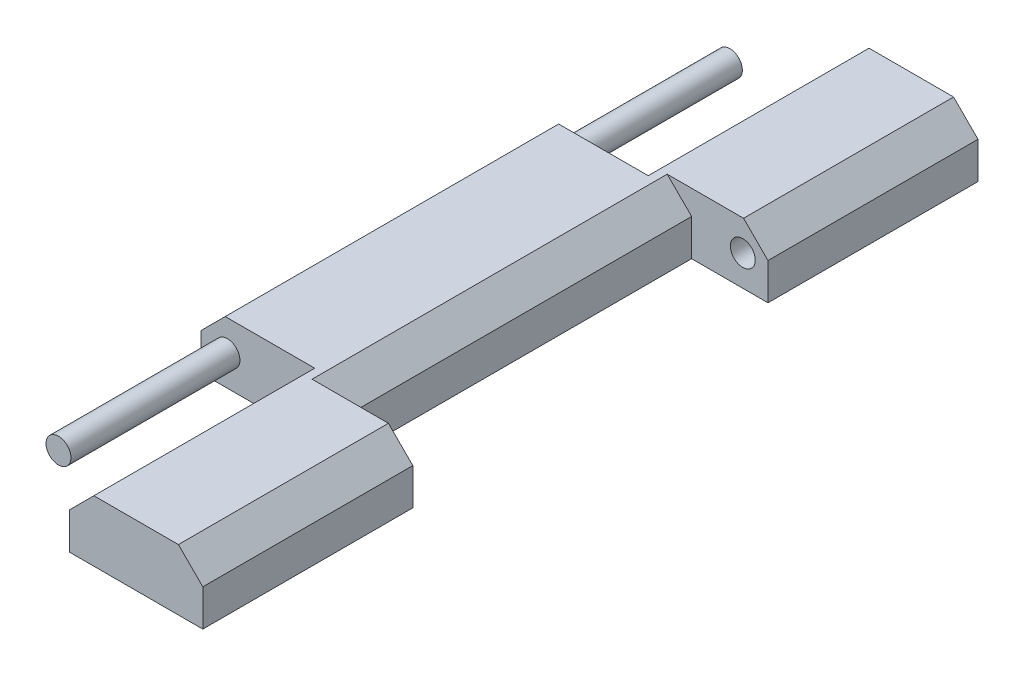
ISO-10303-21;
HEADER;
FILE_DESCRIPTION(('STEP AP214'),'2;1');
FILE_NAME('part.step','',(''),(''),'','','');
FILE_SCHEMA(('AUTOMOTIVE_DESIGN { 1 0 10303 214 1 1 1 1 }'));
ENDSEC;
DATA;
#1=APPLICATION_CONTEXT('core data for automotive mechanical design processes');
#2=APPLICATION_PROTOCOL_DEFINITION('international standard','automotive_design',2000,#1);
#3=PRODUCT_CONTEXT('',#1,'mechanical');
#4=PRODUCT('Part','Part','',(#3));
#5=PRODUCT_RELATED_PRODUCT_CATEGORY('part','',(#4));
#6=PRODUCT_DEFINITION_FORMATION('','',#4);
#7=PRODUCT_DEFINITION_CONTEXT('part definition',#1,'design');
#8=PRODUCT_DEFINITION('design','',#6,#7);
#9=PRODUCT_DEFINITION_SHAPE('','',#8);
#10=(LENGTH_UNIT() NAMED_UNIT(*) SI_UNIT(.MILLI.,.METRE.));
#11=(NAMED_UNIT(*) PLANE_ANGLE_UNIT() SI_UNIT($,.RADIAN.));
#12=(NAMED_UNIT(*) SI_UNIT($,.STERADIAN.) SOLID_ANGLE_UNIT());
#13=UNCERTAINTY_MEASURE_WITH_UNIT(LENGTH_MEASURE(1.E-05),#10,'distance_accuracy_value','');
#14=(GEOMETRIC_REPRESENTATION_CONTEXT(3) GLOBAL_UNCERTAINTY_ASSIGNED_CONTEXT((#13)) GLOBAL_UNIT_ASSIGNED_CONTEXT((#10,
#11,#12)) REPRESENTATION_CONTEXT('',''));
#15=CARTESIAN_POINT('',(0.,0.,0.));
#16=DIRECTION('',(0.,0.,1.));
#17=DIRECTION('',(1.,0.,0.));
#18=AXIS2_PLACEMENT_3D('',#15,#16,#17);
#19=CARTESIAN_POINT('',(-6.13161438081057,5.92420723275193,-42.8625));
#20=DIRECTION('',(0.,0.,1.));
#21=DIRECTION('',(-1.,0.,0.));
#22=AXIS2_PLACEMENT_3D('',#19,#20,#21);
#23=PLANE('',#22);
#24=DIRECTION('',(0.,-1.,0.));
#25=VECTOR('',#24,1.);
#26=CARTESIAN_POINT('',(8.61607262485704,5.92420723275193,-42.8625));
#27=LINE('',#26,#25);
#28=CARTESIAN_POINT('',(8.61607262485704,3.22420723275193,-42.8625));
#29=VERTEX_POINT('',#28);
#30=CARTESIAN_POINT('',(8.61607262485704,-0.825792767248064,-42.8625));
#31=VERTEX_POINT('',#30);
#32=EDGE_CURVE('E169',#29,#31,#27,.T.);
#33=ORIENTED_EDGE('',*,*,#32,.T.);
#34=DIRECTION('',(1.,0.,0.));
#35=VECTOR('',#34,1.);
#36=CARTESIAN_POINT('',(-6.13161438081057,-0.825792767248064,-42.8625));
#37=LINE('',#36,#35);
#38=CARTESIAN_POINT('',(-6.13161438081057,-0.825792767248064,-42.8625));
#39=VERTEX_POINT('',#38);
#40=EDGE_CURVE('E175',#39,#31,#37,.T.);
#41=ORIENTED_EDGE('',*,*,#40,.F.);
#42=DIRECTION('',(0.,-1.,0.));
#43=VECTOR('',#42,1.);
#44=CARTESIAN_POINT('',(-6.13161438081057,5.92420723275193,-42.8625));
#45=LINE('',#44,#43);
#46=CARTESIAN_POINT('',(-6.13161438081057,3.22420723275193,-42.8625));
#47=VERTEX_POINT('',#46);
#48=EDGE_CURVE('E274',#47,#39,#45,.T.);
#49=ORIENTED_EDGE('',*,*,#48,.F.);
#50=DIRECTION('',(0.707106781186548,0.707106781186548,0.));
#51=VECTOR('',#50,1.);
#52=CARTESIAN_POINT('',(-3.43161438081056,5.92420723275195,-42.8625));
#53=LINE('',#52,#51);
#54=CARTESIAN_POINT('',(-3.43161438081057,5.92420723275193,-42.8625));
#55=VERTEX_POINT('',#54);
#56=EDGE_CURVE('E225',#55,#47,#53,.F.);
#57=ORIENTED_EDGE('',*,*,#56,.F.);
#58=DIRECTION('',(1.,0.,0.));
#59=VECTOR('',#58,1.);
#60=CARTESIAN_POINT('',(-6.13161438081057,5.92420723275193,-42.8625));
#61=LINE('',#60,#59);
#62=CARTESIAN_POINT('',(5.91607262485704,5.92420723275193,-42.8625));
#63=VERTEX_POINT('',#62);
#64=EDGE_CURVE('E258',#55,#63,#61,.T.);
#65=ORIENTED_EDGE('',*,*,#64,.T.);
#66=DIRECTION('',(0.707106781186548,-0.707106781186548,0.));
#67=VECTOR('',#66,1.);
#68=CARTESIAN_POINT('',(5.91607262485758,5.92420723275139,-42.8625));
#69=LINE('',#68,#67);
#70=EDGE_CURVE('E189',#29,#63,#69,.F.);
#71=ORIENTED_EDGE('',*,*,#70,.F.);
#72=EDGE_LOOP('',(#33,#41,#49,#57,#65,#71));
#73=FACE_BOUND('',#72,.T.);
#74=ADVANCED_FACE('F37',(#73),#23,.F.);
#75=CARTESIAN_POINT('',(8.61607262485762,5.92420723275193,-19.6362347014294));
#76=DIRECTION('',(-1.,0.,0.));
#77=DIRECTION('',(0.,0.,-1.));
#78=AXIS2_PLACEMENT_3D('',#75,#76,#77);
#79=PLANE('',#78);
#80=DIRECTION('',(0.,-1.,0.));
#81=VECTOR('',#80,1.);
#82=CARTESIAN_POINT('',(8.61607262485762,5.92420723275193,-19.6362347014294));
#83=LINE('',#82,#81);
#84=CARTESIAN_POINT('',(8.61607262485762,3.22420723275193,-19.6362347014294));
#85=VERTEX_POINT('',#84);
#86=CARTESIAN_POINT('',(8.61607262485762,-0.825792767248064,-19.6362347014294));
#87=VERTEX_POINT('',#86);
#88=EDGE_CURVE('E171',#85,#87,#83,.T.);
#89=ORIENTED_EDGE('',*,*,#88,.T.);
#90=DIRECTION('',(0.,0.,1.));
#91=VECTOR('',#90,1.);
#92=CARTESIAN_POINT('',(8.61607262485762,-0.825792767248064,-19.6362347014294));
#93=LINE('',#92,#91);
#94=EDGE_CURVE('E164',#31,#87,#93,.T.);
#95=ORIENTED_EDGE('',*,*,#94,.F.);
#96=ORIENTED_EDGE('',*,*,#32,.F.);
#97=DIRECTION('',(0.,0.,-1.));
#98=VECTOR('',#97,1.);
#99=CARTESIAN_POINT('',(8.61607262485762,3.22420723275193,-19.6362347014294));
#100=LINE('',#99,#98);
#101=EDGE_CURVE('E223',#85,#29,#100,.T.);
#102=ORIENTED_EDGE('',*,*,#101,.F.);
#103=EDGE_LOOP('',(#89,#95,#96,#102));
#104=FACE_BOUND('',#103,.T.);
#105=ADVANCED_FACE('F166',(#104),#79,.F.);
#106=CARTESIAN_POINT('',(8.61607262485762,5.92420723275193,-19.6362347014294));
#107=DIRECTION('',(0.,0.,-1.));
#108=DIRECTION('',(1.,0.,0.));
#109=AXIS2_PLACEMENT_3D('',#106,#107,#108);
#110=PLANE('',#109);
#111=CARTESIAN_POINT('',(5.8326217708247,2.54920723275193,-19.6362347014294));
#112=DIRECTION('',(0.,0.,1.));
#113=DIRECTION('',(1.,0.,0.));
#114=AXIS2_PLACEMENT_3D('',#111,#112,#113);
#115=CIRCLE('',#114,1.37928339962338);
#116=CARTESIAN_POINT('',(7.21190517044808,2.54920723275193,-19.6362347014294));
#117=VERTEX_POINT('',#116);
#118=EDGE_CURVE('E253',#117,#117,#115,.F.);
#119=ORIENTED_EDGE('',*,*,#118,.T.);
#120=EDGE_LOOP('',(#119));
#121=FACE_BOUND('',#120,.T.);
#122=DIRECTION('',(-1.,0.,0.));
#123=VECTOR('',#122,1.);
#124=CARTESIAN_POINT('',(8.61607262485762,5.92420723275193,-19.6362347014294));
#125=LINE('',#124,#123);
#126=CARTESIAN_POINT('',(5.91607262485761,5.92420723275193,-19.6362347014294));
#127=VERTEX_POINT('',#126);
#128=CARTESIAN_POINT('',(-2.52710417271163,5.92420723275193,-19.6362347014294));
#129=VERTEX_POINT('',#128);
#130=EDGE_CURVE('E260',#127,#129,#125,.T.);
#131=ORIENTED_EDGE('',*,*,#130,.T.);
#132=DIRECTION('',(0.707106781186546,-0.707106781186549,0.));
#133=VECTOR('',#132,1.);
#134=CARTESIAN_POINT('',(3.04448422607298,0.352618833967311,-19.6362347014294));
#135=LINE('',#134,#133);
#136=CARTESIAN_POINT('',(0.172895827288381,3.22420723275191,-19.6362347014294));
#137=VERTEX_POINT('',#136);
#138=EDGE_CURVE('E46',#137,#129,#135,.F.);
#139=ORIENTED_EDGE('',*,*,#138,.F.);
#140=DIRECTION('',(0.,-1.,0.));
#141=VECTOR('',#140,1.);
#142=CARTESIAN_POINT('',(0.172895827288381,5.92420723275193,-19.6362347014294));
#143=LINE('',#142,#141);
#144=CARTESIAN_POINT('',(0.172895827288381,-0.825792767248064,-19.6362347014294));
#145=VERTEX_POINT('',#144);
#146=EDGE_CURVE('E194',#137,#145,#143,.T.);
#147=ORIENTED_EDGE('',*,*,#146,.T.);
#148=DIRECTION('',(-1.,0.,0.));
#149=VECTOR('',#148,1.);
#150=CARTESIAN_POINT('',(8.61607262485762,-0.825792767248064,-19.6362347014294));
#151=LINE('',#150,#149);
#152=EDGE_CURVE('E174',#87,#145,#151,.T.);
#153=ORIENTED_EDGE('',*,*,#152,.F.);
#154=ORIENTED_EDGE('',*,*,#88,.F.);
#155=DIRECTION('',(-0.707106781186548,0.707106781186548,0.));
#156=VECTOR('',#155,1.);
#157=CARTESIAN_POINT('',(5.91607262485786,5.92420723275169,-19.6362347014294));
#158=LINE('',#157,#156);
#159=EDGE_CURVE('E221',#127,#85,#158,.F.);
#160=ORIENTED_EDGE('',*,*,#159,.F.);
#161=EDGE_LOOP('',(#131,#139,#147,#153,#154,#160));
#162=FACE_BOUND('',#161,.T.);
#163=ADVANCED_FACE('F329',(#121,#162),#110,.F.);
#164=CARTESIAN_POINT('',(0.172895827288381,5.92420723275193,-19.6362347014294));
#165=DIRECTION('',(-1.,0.,0.));
#166=DIRECTION('',(0.,0.,-1.));
#167=AXIS2_PLACEMENT_3D('',#164,#165,#166);
#168=PLANE('',#167);
#169=DIRECTION('',(0.,-1.,0.));
#170=VECTOR('',#169,1.);
#171=CARTESIAN_POINT('',(0.172895827288381,5.92420723275193,19.6362347014294));
#172=LINE('',#171,#170);
#173=CARTESIAN_POINT('',(0.172895827288381,3.22420723275191,19.6362347014294));
#174=VERTEX_POINT('',#173);
#175=CARTESIAN_POINT('',(0.172895827288381,-0.825792767248064,19.6362347014294));
#176=VERTEX_POINT('',#175);
#177=EDGE_CURVE('E323',#174,#176,#172,.T.);
#178=ORIENTED_EDGE('',*,*,#177,.T.);
#179=DIRECTION('',(0.,0.,1.));
#180=VECTOR('',#179,1.);
#181=CARTESIAN_POINT('',(0.172895827288381,-0.825792767248064,-19.6362347014294));
#182=LINE('',#181,#180);
#183=EDGE_CURVE('E277',#145,#176,#182,.T.);
#184=ORIENTED_EDGE('',*,*,#183,.F.);
#185=ORIENTED_EDGE('',*,*,#146,.F.);
#186=DIRECTION('',(0.,0.,-1.));
#187=VECTOR('',#186,1.);
#188=CARTESIAN_POINT('',(0.172895827288381,3.22420723275191,-19.6362347014294));
#189=LINE('',#188,#187);
#190=EDGE_CURVE('E219',#174,#137,#189,.T.);
#191=ORIENTED_EDGE('',*,*,#190,.F.);
#192=EDGE_LOOP('',(#178,#184,#185,#191));
#193=FACE_BOUND('',#192,.T.);
#194=ADVANCED_FACE('F332',(#193),#168,.F.);
#195=CARTESIAN_POINT('',(8.61607262485761,5.92420723275193,19.6362347014294));
#196=DIRECTION('',(0.,0.,1.));
#197=DIRECTION('',(-1.,0.,0.));
#198=AXIS2_PLACEMENT_3D('',#195,#196,#197);
#199=PLANE('',#198);
#200=CARTESIAN_POINT('',(5.8326217708247,2.54920723275193,19.6362347014294));
#201=DIRECTION('',(0.,0.,-1.));
#202=DIRECTION('',(-1.,0.,0.));
#203=AXIS2_PLACEMENT_3D('',#200,#201,#202);
#204=CIRCLE('',#203,1.37928339962338);
#205=CARTESIAN_POINT('',(4.45333837120131,2.54920723275193,19.6362347014294));
#206=VERTEX_POINT('',#205);
#207=EDGE_CURVE('E41',#206,#206,#204,.F.);
#208=ORIENTED_EDGE('',*,*,#207,.T.);
#209=EDGE_LOOP('',(#208));
#210=FACE_BOUND('',#209,.T.);
#211=DIRECTION('',(0.,-1.,0.));
#212=VECTOR('',#211,1.);
#213=CARTESIAN_POINT('',(8.61607262485761,5.92420723275193,19.6362347014294));
#214=LINE('',#213,#212);
#215=CARTESIAN_POINT('',(8.61607262485761,3.22420723275191,19.6362347014294));
#216=VERTEX_POINT('',#215);
#217=CARTESIAN_POINT('',(8.61607262485761,-0.825792767248064,19.6362347014294));
#218=VERTEX_POINT('',#217);
#219=EDGE_CURVE('E320',#216,#218,#214,.T.);
#220=ORIENTED_EDGE('',*,*,#219,.T.);
#221=DIRECTION('',(1.,0.,0.));
#222=VECTOR('',#221,1.);
#223=CARTESIAN_POINT('',(8.61607262485761,-0.825792767248064,19.6362347014294));
#224=LINE('',#223,#222);
#225=EDGE_CURVE('E280',#176,#218,#224,.T.);
#226=ORIENTED_EDGE('',*,*,#225,.F.);
#227=ORIENTED_EDGE('',*,*,#177,.F.);
#228=DIRECTION('',(-0.707106781186546,0.707106781186549,0.));
#229=VECTOR('',#228,1.);
#230=CARTESIAN_POINT('',(3.04448422607297,0.352618833967311,19.6362347014294));
#231=LINE('',#230,#229);
#232=CARTESIAN_POINT('',(-2.52710417271163,5.92420723275193,19.6362347014294));
#233=VERTEX_POINT('',#232);
#234=EDGE_CURVE('E237',#233,#174,#231,.F.);
#235=ORIENTED_EDGE('',*,*,#234,.F.);
#236=DIRECTION('',(1.,0.,0.));
#237=VECTOR('',#236,1.);
#238=CARTESIAN_POINT('',(8.61607262485761,5.92420723275193,19.6362347014294));
#239=LINE('',#238,#237);
#240=CARTESIAN_POINT('',(5.9160726248576,5.92420723275193,19.6362347014294));
#241=VERTEX_POINT('',#240);
#242=EDGE_CURVE('E263',#233,#241,#239,.T.);
#243=ORIENTED_EDGE('',*,*,#242,.T.);
#244=DIRECTION('',(0.707106781186546,-0.707106781186549,0.));
#245=VECTOR('',#244,1.);
#246=CARTESIAN_POINT('',(5.91607262485785,5.92420723275168,19.6362347014294));
#247=LINE('',#246,#245);
#248=EDGE_CURVE('E214',#216,#241,#247,.F.);
#249=ORIENTED_EDGE('',*,*,#248,.F.);
#250=EDGE_LOOP('',(#220,#226,#227,#235,#243,#249));
#251=FACE_BOUND('',#250,.T.);
#252=ADVANCED_FACE('F337',(#210,#251),#199,.F.);
#253=CARTESIAN_POINT('',(8.61607262485703,5.92420723275193,42.8625));
#254=DIRECTION('',(-1.,0.,0.));
#255=DIRECTION('',(0.,0.,-1.));
#256=AXIS2_PLACEMENT_3D('',#253,#254,#255);
#257=PLANE('',#256);
#258=DIRECTION('',(0.,-1.,0.));
#259=VECTOR('',#258,1.);
#260=CARTESIAN_POINT('',(8.61607262485703,5.92420723275193,42.8625));
#261=LINE('',#260,#259);
#262=CARTESIAN_POINT('',(8.61607262485703,3.22420723275191,42.8625));
#263=VERTEX_POINT('',#262);
#264=CARTESIAN_POINT('',(8.61607262485703,-0.825792767248064,42.8625));
#265=VERTEX_POINT('',#264);
#266=EDGE_CURVE('E317',#263,#265,#261,.T.);
#267=ORIENTED_EDGE('',*,*,#266,.T.);
#268=DIRECTION('',(0.,0.,1.));
#269=VECTOR('',#268,1.);
#270=CARTESIAN_POINT('',(8.61607262485703,-0.825792767248064,42.8625));
#271=LINE('',#270,#269);
#272=EDGE_CURVE('E283',#218,#265,#271,.T.);
#273=ORIENTED_EDGE('',*,*,#272,.F.);
#274=ORIENTED_EDGE('',*,*,#219,.F.);
#275=DIRECTION('',(0.,0.,-1.));
#276=VECTOR('',#275,1.);
#277=CARTESIAN_POINT('',(8.61607262485703,3.22420723275191,42.8625));
#278=LINE('',#277,#276);
#279=EDGE_CURVE('E212',#263,#216,#278,.T.);
#280=ORIENTED_EDGE('',*,*,#279,.F.);
#281=EDGE_LOOP('',(#267,#273,#274,#280));
#282=FACE_BOUND('',#281,.T.);
#283=ADVANCED_FACE('F340',(#282),#257,.F.);
#284=CARTESIAN_POINT('',(-6.13161438081057,5.92420723275193,42.8625));
#285=DIRECTION('',(0.,0.,-1.));
#286=DIRECTION('',(1.,0.,0.));
#287=AXIS2_PLACEMENT_3D('',#284,#285,#286);
#288=PLANE('',#287);
#289=DIRECTION('',(-1.,0.,0.));
#290=VECTOR('',#289,1.);
#291=CARTESIAN_POINT('',(-6.13161438081057,5.92420723275193,42.8625));
#292=LINE('',#291,#290);
#293=CARTESIAN_POINT('',(5.91607262485702,5.92420723275193,42.8625));
#294=VERTEX_POINT('',#293);
#295=CARTESIAN_POINT('',(-3.43161438081056,5.92420723275193,42.8625));
#296=VERTEX_POINT('',#295);
#297=EDGE_CURVE('E266',#294,#296,#292,.T.);
#298=ORIENTED_EDGE('',*,*,#297,.T.);
#299=DIRECTION('',(-0.707106781186546,-0.707106781186549,0.));
#300=VECTOR('',#299,1.);
#301=CARTESIAN_POINT('',(-3.43161438081058,5.92420723275191,42.8625));
#302=LINE('',#301,#300);
#303=CARTESIAN_POINT('',(-6.13161438081057,3.22420723275191,42.8625));
#304=VERTEX_POINT('',#303);
#305=EDGE_CURVE('E207',#304,#296,#302,.F.);
#306=ORIENTED_EDGE('',*,*,#305,.F.);
#307=DIRECTION('',(0.,-1.,0.));
#308=VECTOR('',#307,1.);
#309=CARTESIAN_POINT('',(-6.13161438081057,5.92420723275193,42.8625));
#310=LINE('',#309,#308);
#311=CARTESIAN_POINT('',(-6.13161438081057,-0.825792767248064,42.8625));
#312=VERTEX_POINT('',#311);
#313=EDGE_CURVE('E314',#304,#312,#310,.T.);
#314=ORIENTED_EDGE('',*,*,#313,.T.);
#315=DIRECTION('',(-1.,0.,0.));
#316=VECTOR('',#315,1.);
#317=CARTESIAN_POINT('',(-6.13161438081057,-0.825792767248064,42.8625));
#318=LINE('',#317,#316);
#319=EDGE_CURVE('E286',#265,#312,#318,.T.);
#320=ORIENTED_EDGE('',*,*,#319,.F.);
#321=ORIENTED_EDGE('',*,*,#266,.F.);
#322=DIRECTION('',(-0.707106781186546,0.707106781186549,0.));
#323=VECTOR('',#322,1.);
#324=CARTESIAN_POINT('',(5.91607262485754,5.92420723275141,42.8625));
#325=LINE('',#324,#323);
#326=EDGE_CURVE('E210',#294,#263,#325,.F.);
#327=ORIENTED_EDGE('',*,*,#326,.F.);
#328=EDGE_LOOP('',(#298,#306,#314,#320,#321,#327));
#329=FACE_BOUND('',#328,.T.);
#330=ADVANCED_FACE('F344',(#329),#288,.F.);
#331=CARTESIAN_POINT('',(-6.13161438081057,5.92420723275193,42.8625));
#332=DIRECTION('',(1.,0.,0.));
#333=DIRECTION('',(0.,0.,1.));
#334=AXIS2_PLACEMENT_3D('',#331,#332,#333);
#335=PLANE('',#334);
#336=DIRECTION('',(0.,-1.,0.));
#337=VECTOR('',#336,1.);
#338=CARTESIAN_POINT('',(-6.13161438081058,5.92420723275193,18.4379950481214));
#339=LINE('',#338,#337);
#340=CARTESIAN_POINT('',(-6.13161438081058,3.22420723275191,18.4379950481214));
#341=VERTEX_POINT('',#340);
#342=CARTESIAN_POINT('',(-6.13161438081058,-0.825792767248064,18.4379950481214));
#343=VERTEX_POINT('',#342);
#344=EDGE_CURVE('E311',#341,#343,#339,.T.);
#345=ORIENTED_EDGE('',*,*,#344,.T.);
#346=DIRECTION('',(0.,0.,-1.));
#347=VECTOR('',#346,1.);
#348=CARTESIAN_POINT('',(-6.13161438081057,-0.825792767248064,42.8625));
#349=LINE('',#348,#347);
#350=EDGE_CURVE('E289',#312,#343,#349,.T.);
#351=ORIENTED_EDGE('',*,*,#350,.F.);
#352=ORIENTED_EDGE('',*,*,#313,.F.);
#353=DIRECTION('',(0.,0.,1.));
#354=VECTOR('',#353,1.);
#355=CARTESIAN_POINT('',(-6.13161438081057,3.22420723275191,42.8625));
#356=LINE('',#355,#354);
#357=EDGE_CURVE('E217',#341,#304,#356,.T.);
#358=ORIENTED_EDGE('',*,*,#357,.F.);
#359=EDGE_LOOP('',(#345,#351,#352,#358));
#360=FACE_BOUND('',#359,.T.);
#361=ADVANCED_FACE('F351',(#360),#335,.F.);
#362=CARTESIAN_POINT('',(-16.0321087449545,5.92420723275193,18.4379950481215));
#363=DIRECTION('',(0.,0.,-1.));
#364=DIRECTION('',(1.,0.,0.));
#365=AXIS2_PLACEMENT_3D('',#362,#363,#364);
#366=PLANE('',#365);
#367=CARTESIAN_POINT('',(-13.0836136147864,2.54920723275193,18.4379950481215));
#368=DIRECTION('',(0.,0.,1.));
#369=DIRECTION('',(1.,0.,0.));
#370=AXIS2_PLACEMENT_3D('',#367,#368,#369);
#371=CIRCLE('',#370,1.37928339962338);
#372=CARTESIAN_POINT('',(-11.7043302151631,2.54920723275193,18.4379950481215));
#373=VERTEX_POINT('',#372);
#374=EDGE_CURVE('E184',#373,#373,#371,.T.);
#375=ORIENTED_EDGE('',*,*,#374,.F.);
#376=EDGE_LOOP('',(#375));
#377=FACE_BOUND('',#376,.T.);
#378=DIRECTION('',(0.,-1.,0.));
#379=VECTOR('',#378,1.);
#380=CARTESIAN_POINT('',(-16.0321087449545,5.92420723275193,18.4379950481215));
#381=LINE('',#380,#379);
#382=CARTESIAN_POINT('',(-16.0321087449545,3.22420723275191,18.4379950481215));
#383=VERTEX_POINT('',#382);
#384=CARTESIAN_POINT('',(-16.0321087449545,-0.825792767248064,18.4379950481215));
#385=VERTEX_POINT('',#384);
#386=EDGE_CURVE('E308',#383,#385,#381,.T.);
#387=ORIENTED_EDGE('',*,*,#386,.T.);
#388=DIRECTION('',(-1.,0.,0.));
#389=VECTOR('',#388,1.);
#390=CARTESIAN_POINT('',(-16.0321087449545,-0.825792767248064,18.4379950481215));
#391=LINE('',#390,#389);
#392=EDGE_CURVE('E292',#343,#385,#391,.T.);
#393=ORIENTED_EDGE('',*,*,#392,.F.);
#394=ORIENTED_EDGE('',*,*,#344,.F.);
#395=DIRECTION('',(0.707106781186546,0.707106781186549,0.));
#396=VECTOR('',#395,1.);
#397=CARTESIAN_POINT('',(-9.73186156288253,-0.376039949320052,18.4379950481215));
#398=LINE('',#397,#396);
#399=CARTESIAN_POINT('',(-3.43161438081058,5.92420723275193,18.4379950481214));
#400=VERTEX_POINT('',#399);
#401=EDGE_CURVE('E235',#400,#341,#398,.F.);
#402=ORIENTED_EDGE('',*,*,#401,.F.);
#403=DIRECTION('',(-1.,0.,0.));
#404=VECTOR('',#403,1.);
#405=CARTESIAN_POINT('',(-16.0321087449545,5.92420723275193,18.4379950481215));
#406=LINE('',#405,#404);
#407=CARTESIAN_POINT('',(-13.3321087449545,5.92420723275193,18.4379950481215));
#408=VERTEX_POINT('',#407);
#409=EDGE_CURVE('E269',#400,#408,#406,.T.);
#410=ORIENTED_EDGE('',*,*,#409,.T.);
#411=DIRECTION('',(-0.707106781186546,-0.707106781186549,0.));
#412=VECTOR('',#411,1.);
#413=CARTESIAN_POINT('',(-13.3321087449546,5.9242072327519,18.4379950481215));
#414=LINE('',#413,#412);
#415=EDGE_CURVE('E233',#383,#408,#414,.F.);
#416=ORIENTED_EDGE('',*,*,#415,.F.);
#417=EDGE_LOOP('',(#387,#393,#394,#402,#410,#416));
#418=FACE_BOUND('',#417,.T.);
#419=ADVANCED_FACE('F354',(#377,#418),#366,.F.);
#420=CARTESIAN_POINT('',(-16.0321087449545,5.92420723275193,18.4379950481215));
#421=DIRECTION('',(1.,0.,0.));
#422=DIRECTION('',(0.,0.,1.));
#423=AXIS2_PLACEMENT_3D('',#420,#421,#422);
#424=PLANE('',#423);
#425=DIRECTION('',(0.,-1.,0.));
#426=VECTOR('',#425,1.);
#427=CARTESIAN_POINT('',(-16.0321087449549,5.92420723275193,-18.4379950481214));
#428=LINE('',#427,#426);
#429=CARTESIAN_POINT('',(-16.0321087449549,3.22420723275191,-18.4379950481214));
#430=VERTEX_POINT('',#429);
#431=CARTESIAN_POINT('',(-16.0321087449549,-0.825792767248064,-18.4379950481214));
#432=VERTEX_POINT('',#431);
#433=EDGE_CURVE('E305',#430,#432,#428,.T.);
#434=ORIENTED_EDGE('',*,*,#433,.T.);
#435=DIRECTION('',(0.,0.,-1.));
#436=VECTOR('',#435,1.);
#437=CARTESIAN_POINT('',(-16.0321087449545,-0.825792767248064,18.4379950481215));
#438=LINE('',#437,#436);
#439=EDGE_CURVE('E295',#385,#432,#438,.T.);
#440=ORIENTED_EDGE('',*,*,#439,.F.);
#441=ORIENTED_EDGE('',*,*,#386,.F.);
#442=DIRECTION('',(0.,0.,1.));
#443=VECTOR('',#442,1.);
#444=CARTESIAN_POINT('',(-16.0321087449545,3.22420723275191,18.4379950481215));
#445=LINE('',#444,#443);
#446=EDGE_CURVE('E54',#430,#383,#445,.T.);
#447=ORIENTED_EDGE('',*,*,#446,.F.);
#448=EDGE_LOOP('',(#434,#440,#441,#447));
#449=FACE_BOUND('',#448,.T.);
#450=ADVANCED_FACE('F357',(#449),#424,.F.);
#451=CARTESIAN_POINT('',(-16.0321087449549,5.92420723275193,-18.4379950481214));
#452=DIRECTION('',(0.,0.,1.));
#453=DIRECTION('',(-1.,0.,0.));
#454=AXIS2_PLACEMENT_3D('',#451,#452,#453);
#455=PLANE('',#454);
#456=CARTESIAN_POINT('',(-13.0836136147864,2.54920723275193,-18.4379950481214));
#457=DIRECTION('',(0.,0.,-1.));
#458=DIRECTION('',(-1.,0.,0.));
#459=AXIS2_PLACEMENT_3D('',#456,#457,#458);
#460=CIRCLE('',#459,1.37928339962338);
#461=CARTESIAN_POINT('',(-14.4628970144098,2.54920723275193,-18.4379950481214));
#462=VERTEX_POINT('',#461);
#463=EDGE_CURVE('E240',#462,#462,#460,.T.);
#464=ORIENTED_EDGE('',*,*,#463,.F.);
#465=EDGE_LOOP('',(#464));
#466=FACE_BOUND('',#465,.T.);
#467=DIRECTION('',(1.,0.,0.));
#468=VECTOR('',#467,1.);
#469=CARTESIAN_POINT('',(-16.0321087449549,5.92420723275193,-18.4379950481214));
#470=LINE('',#469,#468);
#471=CARTESIAN_POINT('',(-13.3321087449549,5.92420723275193,-18.4379950481214));
#472=VERTEX_POINT('',#471);
#473=CARTESIAN_POINT('',(-3.43161438081057,5.92420723275193,-18.4379950481214));
#474=VERTEX_POINT('',#473);
#475=EDGE_CURVE('E272',#472,#474,#470,.T.);
#476=ORIENTED_EDGE('',*,*,#475,.T.);
#477=DIRECTION('',(-0.707106781186548,-0.707106781186548,0.));
#478=VECTOR('',#477,1.);
#479=CARTESIAN_POINT('',(-9.73186156288273,-0.376039949320231,-18.4379950481214));
#480=LINE('',#479,#478);
#481=CARTESIAN_POINT('',(-6.13161438081057,3.22420723275193,-18.4379950481214));
#482=VERTEX_POINT('',#481);
#483=EDGE_CURVE('E11',#482,#474,#480,.F.);
#484=ORIENTED_EDGE('',*,*,#483,.F.);
#485=DIRECTION('',(0.,-1.,0.));
#486=VECTOR('',#485,1.);
#487=CARTESIAN_POINT('',(-6.13161438081057,5.92420723275193,-18.4379950481214));
#488=LINE('',#487,#486);
#489=CARTESIAN_POINT('',(-6.13161438081057,-0.825792767248064,-18.4379950481214));
#490=VERTEX_POINT('',#489);
#491=EDGE_CURVE('E302',#482,#490,#488,.T.);
#492=ORIENTED_EDGE('',*,*,#491,.T.);
#493=DIRECTION('',(1.,0.,0.));
#494=VECTOR('',#493,1.);
#495=CARTESIAN_POINT('',(-16.0321087449549,-0.825792767248064,-18.4379950481214));
#496=LINE('',#495,#494);
#497=EDGE_CURVE('E298',#432,#490,#496,.T.);
#498=ORIENTED_EDGE('',*,*,#497,.F.);
#499=ORIENTED_EDGE('',*,*,#433,.F.);
#500=DIRECTION('',(0.707106781186546,0.707106781186549,0.));
#501=VECTOR('',#500,1.);
#502=CARTESIAN_POINT('',(-13.3321087449548,5.92420723275199,-18.4379950481214));
#503=LINE('',#502,#501);
#504=EDGE_CURVE('E59',#472,#430,#503,.F.);
#505=ORIENTED_EDGE('',*,*,#504,.F.);
#506=EDGE_LOOP('',(#476,#484,#492,#498,#499,#505));
#507=FACE_BOUND('',#506,.T.);
#508=ADVANCED_FACE('F362',(#466,#507),#455,.F.);
#509=CARTESIAN_POINT('',(-6.13161438081057,5.92420723275193,-18.4379950481214));
#510=DIRECTION('',(1.,0.,0.));
#511=DIRECTION('',(0.,0.,1.));
#512=AXIS2_PLACEMENT_3D('',#509,#510,#511);
#513=PLANE('',#512);
#514=ORIENTED_EDGE('',*,*,#48,.T.);
#515=DIRECTION('',(0.,0.,-1.));
#516=VECTOR('',#515,1.);
#517=CARTESIAN_POINT('',(-6.13161438081057,-0.825792767248064,-18.4379950481214));
#518=LINE('',#517,#516);
#519=EDGE_CURVE('E180',#490,#39,#518,.T.);
#520=ORIENTED_EDGE('',*,*,#519,.F.);
#521=ORIENTED_EDGE('',*,*,#491,.F.);
#522=DIRECTION('',(0.,0.,1.));
#523=VECTOR('',#522,1.);
#524=CARTESIAN_POINT('',(-6.13161438081057,3.22420723275193,-18.4379950481214));
#525=LINE('',#524,#523);
#526=EDGE_CURVE('E229',#47,#482,#525,.T.);
#527=ORIENTED_EDGE('',*,*,#526,.F.);
#528=EDGE_LOOP('',(#514,#520,#521,#527));
#529=FACE_BOUND('',#528,.T.);
#530=ADVANCED_FACE('F364',(#529),#513,.F.);
#531=CARTESIAN_POINT('',(1.24222912202352,5.92420723275193,0.));
#532=DIRECTION('',(0.,-1.,0.));
#533=DIRECTION('',(0.,0.,1.));
#534=AXIS2_PLACEMENT_3D('',#531,#532,#533);
#535=PLANE('',#534);
#536=ORIENTED_EDGE('',*,*,#242,.F.);
#537=DIRECTION('',(0.,0.,1.));
#538=VECTOR('',#537,1.);
#539=CARTESIAN_POINT('',(-2.52710417271163,5.92420723275193,0.));
#540=LINE('',#539,#538);
#541=EDGE_CURVE('E201',#129,#233,#540,.T.);
#542=ORIENTED_EDGE('',*,*,#541,.F.);
#543=ORIENTED_EDGE('',*,*,#130,.F.);
#544=DIRECTION('',(0.,0.,1.));
#545=VECTOR('',#544,1.);
#546=CARTESIAN_POINT('',(5.9160726248581,5.92420723275193,-1.0539703509202E-13));
#547=LINE('',#546,#545);
#548=EDGE_CURVE('E199',#63,#127,#547,.T.);
#549=ORIENTED_EDGE('',*,*,#548,.F.);
#550=ORIENTED_EDGE('',*,*,#64,.F.);
#551=DIRECTION('',(0.,0.,-1.));
#552=VECTOR('',#551,1.);
#553=CARTESIAN_POINT('',(-3.43161438081057,5.92420723275193,0.));
#554=LINE('',#553,#552);
#555=EDGE_CURVE('E192',#474,#55,#554,.T.);
#556=ORIENTED_EDGE('',*,*,#555,.F.);
#557=ORIENTED_EDGE('',*,*,#475,.F.);
#558=DIRECTION('',(0.,0.,-1.));
#559=VECTOR('',#558,1.);
#560=CARTESIAN_POINT('',(-13.3321087449547,5.92420723275193,1.50512172245589E-13));
#561=LINE('',#560,#559);
#562=EDGE_CURVE('E190',#408,#472,#561,.T.);
#563=ORIENTED_EDGE('',*,*,#562,.F.);
#564=ORIENTED_EDGE('',*,*,#409,.F.);
#565=DIRECTION('',(0.,0.,-1.));
#566=VECTOR('',#565,1.);
#567=CARTESIAN_POINT('',(-3.43161438081058,5.92420723275193,0.));
#568=LINE('',#567,#566);
#569=EDGE_CURVE('E203',#296,#400,#568,.T.);
#570=ORIENTED_EDGE('',*,*,#569,.F.);
#571=ORIENTED_EDGE('',*,*,#297,.F.);
#572=DIRECTION('',(0.,0.,1.));
#573=VECTOR('',#572,1.);
#574=CARTESIAN_POINT('',(5.91607262485809,5.92420723275193,1.2693319779243E-13));
#575=LINE('',#574,#573);
#576=EDGE_CURVE('E205',#241,#294,#575,.T.);
#577=ORIENTED_EDGE('',*,*,#576,.F.);
#578=EDGE_LOOP('',(#536,#542,#543,#549,#550,#556,#557,#563,#564,#570,#571,#577));
#579=FACE_BOUND('',#578,.T.);
#580=ADVANCED_FACE('F372',(#579),#535,.F.);
#581=CARTESIAN_POINT('',(1.24222912202352,-0.825792767248064,0.));
#582=DIRECTION('',(0.,-1.,0.));
#583=DIRECTION('',(0.,0.,1.));
#584=AXIS2_PLACEMENT_3D('',#581,#582,#583);
#585=PLANE('',#584);
#586=ORIENTED_EDGE('',*,*,#40,.T.);
#587=ORIENTED_EDGE('',*,*,#94,.T.);
#588=ORIENTED_EDGE('',*,*,#152,.T.);
#589=ORIENTED_EDGE('',*,*,#183,.T.);
#590=ORIENTED_EDGE('',*,*,#225,.T.);
#591=ORIENTED_EDGE('',*,*,#272,.T.);
#592=ORIENTED_EDGE('',*,*,#319,.T.);
#593=ORIENTED_EDGE('',*,*,#350,.T.);
#594=ORIENTED_EDGE('',*,*,#392,.T.);
#595=ORIENTED_EDGE('',*,*,#439,.T.);
#596=ORIENTED_EDGE('',*,*,#497,.T.);
#597=ORIENTED_EDGE('',*,*,#519,.T.);
#598=EDGE_LOOP('',(#586,#587,#588,#589,#590,#591,#592,#593,#594,#595,#596,#597));
#599=FACE_BOUND('',#598,.T.);
#600=ADVANCED_FACE('F178',(#599),#585,.T.);
#601=CARTESIAN_POINT('',(5.91607262485809,5.92420723275193,1.2693319779243E-13));
#602=DIRECTION('',(-0.707106781186549,-0.707106781186546,0.));
#603=DIRECTION('',(0.,0.,1.));
#604=AXIS2_PLACEMENT_3D('',#601,#602,#603);
#605=PLANE('',#604);
#606=ORIENTED_EDGE('',*,*,#248,.T.);
#607=ORIENTED_EDGE('',*,*,#576,.T.);
#608=ORIENTED_EDGE('',*,*,#326,.T.);
#609=ORIENTED_EDGE('',*,*,#279,.T.);
#610=EDGE_LOOP('',(#606,#607,#608,#609));
#611=FACE_BOUND('',#610,.T.);
#612=ADVANCED_FACE('F395',(#611),#605,.F.);
#613=CARTESIAN_POINT('',(-3.43161438081058,5.92420723275193,0.));
#614=DIRECTION('',(0.707106781186549,-0.707106781186546,0.));
#615=DIRECTION('',(0.,0.,-1.));
#616=AXIS2_PLACEMENT_3D('',#613,#614,#615);
#617=PLANE('',#616);
#618=ORIENTED_EDGE('',*,*,#305,.T.);
#619=ORIENTED_EDGE('',*,*,#569,.T.);
#620=ORIENTED_EDGE('',*,*,#401,.T.);
#621=ORIENTED_EDGE('',*,*,#357,.T.);
#622=EDGE_LOOP('',(#618,#619,#620,#621));
#623=FACE_BOUND('',#622,.T.);
#624=ADVANCED_FACE('F384',(#623),#617,.F.);
#625=CARTESIAN_POINT('',(-2.52710417271163,5.92420723275193,0.));
#626=DIRECTION('',(-0.707106781186549,-0.707106781186546,0.));
#627=DIRECTION('',(0.,0.,1.));
#628=AXIS2_PLACEMENT_3D('',#625,#626,#627);
#629=PLANE('',#628);
#630=ORIENTED_EDGE('',*,*,#138,.T.);
#631=ORIENTED_EDGE('',*,*,#541,.T.);
#632=ORIENTED_EDGE('',*,*,#234,.T.);
#633=ORIENTED_EDGE('',*,*,#190,.T.);
#634=EDGE_LOOP('',(#630,#631,#632,#633));
#635=FACE_BOUND('',#634,.T.);
#636=ADVANCED_FACE('F378',(#635),#629,.F.);
#637=CARTESIAN_POINT('',(5.9160726248581,5.92420723275193,-1.0539703509202E-13));
#638=DIRECTION('',(-0.707106781186547,-0.707106781186547,0.));
#639=DIRECTION('',(0.,0.,1.));
#640=AXIS2_PLACEMENT_3D('',#637,#638,#639);
#641=PLANE('',#640);
#642=ORIENTED_EDGE('',*,*,#70,.T.);
#643=ORIENTED_EDGE('',*,*,#548,.T.);
#644=ORIENTED_EDGE('',*,*,#159,.T.);
#645=ORIENTED_EDGE('',*,*,#101,.T.);
#646=EDGE_LOOP('',(#642,#643,#644,#645));
#647=FACE_BOUND('',#646,.T.);
#648=ADVANCED_FACE('F376',(#647),#641,.F.);
#649=CARTESIAN_POINT('',(-3.43161438081057,5.92420723275193,0.));
#650=DIRECTION('',(0.707106781186547,-0.707106781186547,0.));
#651=DIRECTION('',(0.,0.,-1.));
#652=AXIS2_PLACEMENT_3D('',#649,#650,#651);
#653=PLANE('',#652);
#654=ORIENTED_EDGE('',*,*,#483,.T.);
#655=ORIENTED_EDGE('',*,*,#555,.T.);
#656=ORIENTED_EDGE('',*,*,#56,.T.);
#657=ORIENTED_EDGE('',*,*,#526,.T.);
#658=EDGE_LOOP('',(#654,#655,#656,#657));
#659=FACE_BOUND('',#658,.T.);
#660=ADVANCED_FACE('F368',(#659),#653,.F.);
#661=CARTESIAN_POINT('',(-13.3321087449547,5.92420723275193,1.50512172245589E-13));
#662=DIRECTION('',(0.707106781186549,-0.707106781186546,0.));
#663=DIRECTION('',(0.,0.,-1.));
#664=AXIS2_PLACEMENT_3D('',#661,#662,#663);
#665=PLANE('',#664);
#666=ORIENTED_EDGE('',*,*,#415,.T.);
#667=ORIENTED_EDGE('',*,*,#562,.T.);
#668=ORIENTED_EDGE('',*,*,#504,.T.);
#669=ORIENTED_EDGE('',*,*,#446,.T.);
#670=EDGE_LOOP('',(#666,#667,#668,#669));
#671=FACE_BOUND('',#670,.T.);
#672=ADVANCED_FACE('F39',(#671),#665,.F.);
#673=CARTESIAN_POINT('',(-13.0836136147864,2.54920723275193,-37.1249999999999));
#674=DIRECTION('',(0.,0.,1.));
#675=DIRECTION('',(-1.,0.,0.));
#676=AXIS2_PLACEMENT_3D('',#673,#674,#675);
#677=PLANE('',#676);
#678=CARTESIAN_POINT('',(-13.0836136147864,2.54920723275193,-37.1249999999999));
#679=DIRECTION('',(0.,0.,-1.));
#680=DIRECTION('',(-1.,0.,0.));
#681=AXIS2_PLACEMENT_3D('',#678,#679,#680);
#682=CIRCLE('',#681,1.37928339962338);
#683=CARTESIAN_POINT('',(-14.4628970144098,2.54920723275193,-37.1249999999999));
#684=VERTEX_POINT('',#683);
#685=EDGE_CURVE('E242',#684,#684,#682,.T.);
#686=ORIENTED_EDGE('',*,*,#685,.T.);
#687=EDGE_LOOP('',(#686));
#688=FACE_BOUND('',#687,.T.);
#689=ADVANCED_FACE('F405',(#688),#677,.F.);
#690=CARTESIAN_POINT('',(-13.0836136147864,2.54920723275193,-37.1249999999999));
#691=DIRECTION('',(0.,0.,1.));
#692=DIRECTION('',(-1.,0.,0.));
#693=AXIS2_PLACEMENT_3D('',#690,#691,#692);
#694=CYLINDRICAL_SURFACE('',#693,1.37928339962338);
#695=ORIENTED_EDGE('',*,*,#685,.F.);
#696=EDGE_LOOP('',(#695));
#697=FACE_BOUND('',#696,.T.);
#698=ORIENTED_EDGE('',*,*,#463,.T.);
#699=EDGE_LOOP('',(#698));
#700=FACE_BOUND('',#699,.T.);
#701=ADVANCED_FACE('F409',(#697,#700),#694,.T.);
#702=CARTESIAN_POINT('',(-13.0836136147864,2.54920723275193,37.1250000000001));
#703=DIRECTION('',(0.,0.,-1.));
#704=DIRECTION('',(-1.,0.,0.));
#705=AXIS2_PLACEMENT_3D('',#702,#703,#704);
#706=CIRCLE('',#705,1.37928339962338);
#707=CARTESIAN_POINT('',(-14.4628970144098,2.54920723275193,37.1250000000001));
#708=VERTEX_POINT('',#707);
#709=EDGE_CURVE('E248',#708,#708,#706,.T.);
#710=ORIENTED_EDGE('',*,*,#709,.T.);
#711=EDGE_LOOP('',(#710));
#712=FACE_BOUND('',#711,.T.);
#713=ORIENTED_EDGE('',*,*,#374,.T.);
#714=EDGE_LOOP('',(#713));
#715=FACE_BOUND('',#714,.T.);
#716=ADVANCED_FACE('F414',(#712,#715),#694,.T.);
#717=CARTESIAN_POINT('',(-13.0836136147864,2.54920723275193,37.1250000000001));
#718=DIRECTION('',(0.,0.,1.));
#719=DIRECTION('',(-1.,0.,0.));
#720=AXIS2_PLACEMENT_3D('',#717,#718,#719);
#721=PLANE('',#720);
#722=ORIENTED_EDGE('',*,*,#709,.F.);
#723=EDGE_LOOP('',(#722));
#724=FACE_BOUND('',#723,.T.);
#725=ADVANCED_FACE('F421',(#724),#721,.T.);
#726=CARTESIAN_POINT('',(5.8326217708247,2.54920723275193,37.125));
#727=DIRECTION('',(0.,0.,1.));
#728=DIRECTION('',(-1.,0.,0.));
#729=AXIS2_PLACEMENT_3D('',#726,#727,#728);
#730=PLANE('',#729);
#731=CARTESIAN_POINT('',(5.8326217708247,2.54920723275193,37.125));
#732=DIRECTION('',(0.,0.,-1.));
#733=DIRECTION('',(-1.,0.,0.));
#734=AXIS2_PLACEMENT_3D('',#731,#732,#733);
#735=CIRCLE('',#734,1.37928339962338);
#736=CARTESIAN_POINT('',(4.45333837120131,2.54920723275193,37.125));
#737=VERTEX_POINT('',#736);
#738=EDGE_CURVE('E460',#737,#737,#735,.T.);
#739=ORIENTED_EDGE('',*,*,#738,.T.);
#740=EDGE_LOOP('',(#739));
#741=FACE_BOUND('',#740,.T.);
#742=ADVANCED_FACE('F423',(#741),#730,.F.);
#743=CARTESIAN_POINT('',(5.8326217708247,2.54920723275193,37.125));
#744=DIRECTION('',(0.,0.,-1.));
#745=DIRECTION('',(1.,0.,0.));
#746=AXIS2_PLACEMENT_3D('',#743,#744,#745);
#747=CYLINDRICAL_SURFACE('',#746,1.37928339962338);
#748=ORIENTED_EDGE('',*,*,#738,.F.);
#749=EDGE_LOOP('',(#748));
#750=FACE_BOUND('',#749,.T.);
#751=ORIENTED_EDGE('',*,*,#207,.F.);
#752=EDGE_LOOP('',(#751));
#753=FACE_BOUND('',#752,.T.);
#754=ADVANCED_FACE('F476',(#750,#753),#747,.F.);
#755=CARTESIAN_POINT('',(5.8326217708247,2.54920723275193,-37.125));
#756=DIRECTION('',(0.,0.,-1.));
#757=DIRECTION('',(-1.,0.,0.));
#758=AXIS2_PLACEMENT_3D('',#755,#756,#757);
#759=CIRCLE('',#758,1.37928339962338);
#760=CARTESIAN_POINT('',(4.45333837120131,2.54920723275193,-37.125));
#761=VERTEX_POINT('',#760);
#762=EDGE_CURVE('E463',#761,#761,#759,.T.);
#763=ORIENTED_EDGE('',*,*,#762,.T.);
#764=EDGE_LOOP('',(#763));
#765=FACE_BOUND('',#764,.T.);
#766=ORIENTED_EDGE('',*,*,#118,.F.);
#767=EDGE_LOOP('',(#766));
#768=FACE_BOUND('',#767,.T.);
#769=ADVANCED_FACE('F419',(#765,#768),#747,.F.);
#770=CARTESIAN_POINT('',(5.8326217708247,2.54920723275193,-37.125));
#771=DIRECTION('',(0.,0.,1.));
#772=DIRECTION('',(-1.,0.,0.));
#773=AXIS2_PLACEMENT_3D('',#770,#771,#772);
#774=PLANE('',#773);
#775=ORIENTED_EDGE('',*,*,#762,.F.);
#776=EDGE_LOOP('',(#775));
#777=FACE_BOUND('',#776,.T.);
#778=ADVANCED_FACE('F471',(#777),#774,.T.);
#779=CLOSED_SHELL('',(#74,#105,#163,#194,#252,#283,#330,#361,#419,#450,#508,#530,#580,#600,#612,
#624,#636,#648,#660,#672,#689,#701,#716,#725,#742,#754,#769,#778));
#780=MANIFOLD_SOLID_BREP('B2',#779);
#781=ADVANCED_BREP_SHAPE_REPRESENTATION('',(#18,#780),#14);
#782=SHAPE_DEFINITION_REPRESENTATION(#9,#781);
ENDSEC;
END-ISO-10303-21;
